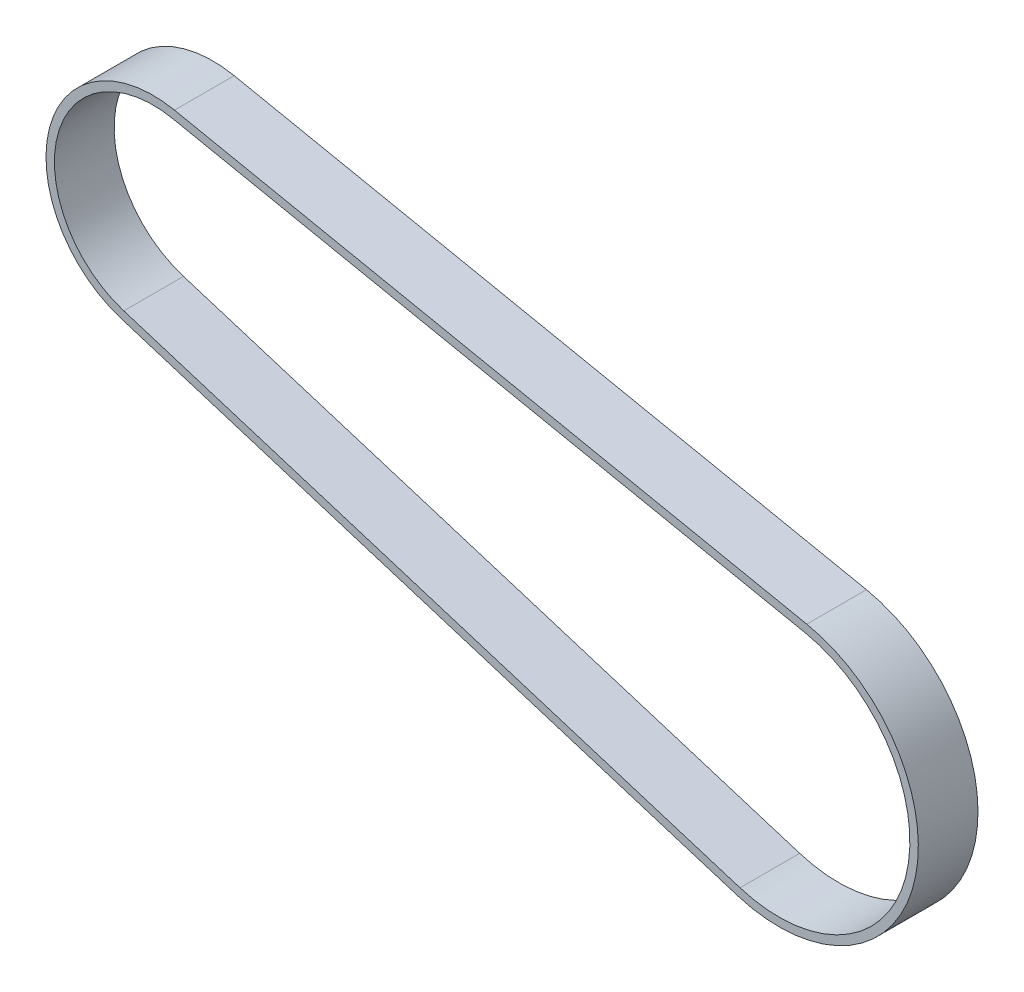
ISO-10303-21;
HEADER;
FILE_DESCRIPTION(('STEP AP214'),'2;1');
FILE_NAME('part.step','',(''),(''),'','','');
FILE_SCHEMA(('AUTOMOTIVE_DESIGN { 1 0 10303 214 1 1 1 1 }'));
ENDSEC;
DATA;
#1=APPLICATION_CONTEXT('core data for automotive mechanical design processes');
#2=APPLICATION_PROTOCOL_DEFINITION('international standard','automotive_design',2000,#1);
#3=PRODUCT_CONTEXT('',#1,'mechanical');
#4=PRODUCT('Part','Part','',(#3));
#5=PRODUCT_RELATED_PRODUCT_CATEGORY('part','',(#4));
#6=PRODUCT_DEFINITION_FORMATION('','',#4);
#7=PRODUCT_DEFINITION_CONTEXT('part definition',#1,'design');
#8=PRODUCT_DEFINITION('design','',#6,#7);
#9=PRODUCT_DEFINITION_SHAPE('','',#8);
#10=(LENGTH_UNIT() NAMED_UNIT(*) SI_UNIT(.MILLI.,.METRE.));
#11=(NAMED_UNIT(*) PLANE_ANGLE_UNIT() SI_UNIT($,.RADIAN.));
#12=(NAMED_UNIT(*) SI_UNIT($,.STERADIAN.) SOLID_ANGLE_UNIT());
#13=UNCERTAINTY_MEASURE_WITH_UNIT(LENGTH_MEASURE(1.E-05),#10,'distance_accuracy_value','');
#14=(GEOMETRIC_REPRESENTATION_CONTEXT(3) GLOBAL_UNCERTAINTY_ASSIGNED_CONTEXT((#13)) GLOBAL_UNIT_ASSIGNED_CONTEXT((#10,
#11,#12)) REPRESENTATION_CONTEXT('',''));
#15=CARTESIAN_POINT('',(0.,0.,0.));
#16=DIRECTION('',(0.,0.,1.));
#17=DIRECTION('',(1.,0.,0.));
#18=AXIS2_PLACEMENT_3D('',#15,#16,#17);
#19=CARTESIAN_POINT('',(8.71789550192988,-17.295897893578,9.));
#20=DIRECTION('',(-0.296824622040405,-0.954932010014625,0.));
#21=DIRECTION('',(0.954932010014625,-0.296824622040405,0.));
#22=AXIS2_PLACEMENT_3D('',#19,#20,#21);
#23=PLANE('',#22);
#24=DIRECTION('',(-0.954932010014625,0.296824622040405,0.));
#25=VECTOR('',#24,1.);
#26=CARTESIAN_POINT('',(8.71789550192988,-17.295897893578,0.));
#27=LINE('',#26,#25);
#28=CARTESIAN_POINT('',(101.620423164441,-46.1730926789959,0.));
#29=VERTEX_POINT('',#28);
#30=CARTESIAN_POINT('',(8.71789550192985,-17.2958978935779,0.));
#31=VERTEX_POINT('',#30);
#32=EDGE_CURVE('E156',#29,#31,#27,.T.);
#33=ORIENTED_EDGE('',*,*,#32,.F.);
#34=DIRECTION('',(0.,0.,-1.));
#35=VECTOR('',#34,1.);
#36=CARTESIAN_POINT('',(101.620423164441,-46.1730926789959,9.));
#37=LINE('',#36,#35);
#38=CARTESIAN_POINT('',(101.620423164441,-46.1730926789959,9.));
#39=VERTEX_POINT('',#38);
#40=EDGE_CURVE('E12',#39,#29,#37,.T.);
#41=ORIENTED_EDGE('',*,*,#40,.F.);
#42=DIRECTION('',(-0.954932010014625,0.296824622040405,0.));
#43=VECTOR('',#42,1.);
#44=CARTESIAN_POINT('',(8.71789550192988,-17.295897893578,9.));
#45=LINE('',#44,#43);
#46=CARTESIAN_POINT('',(8.71789550192985,-17.2958978935779,9.));
#47=VERTEX_POINT('',#46);
#48=EDGE_CURVE('E160',#39,#47,#45,.T.);
#49=ORIENTED_EDGE('',*,*,#48,.T.);
#50=DIRECTION('',(0.,0.,-1.));
#51=VECTOR('',#50,1.);
#52=CARTESIAN_POINT('',(8.71789550192985,-17.2958978935779,9.));
#53=LINE('',#52,#51);
#54=EDGE_CURVE('E61',#47,#31,#53,.T.);
#55=ORIENTED_EDGE('',*,*,#54,.T.);
#56=EDGE_LOOP('',(#33,#41,#49,#55));
#57=FACE_BOUND('',#56,.T.);
#58=ADVANCED_FACE('F58',(#57),#23,.T.);
#59=CARTESIAN_POINT('',(107.85967671973,-26.1004218284885,9.));
#60=DIRECTION('',(0.,0.,-1.));
#61=DIRECTION('',(-1.,0.,0.));
#62=AXIS2_PLACEMENT_3D('',#59,#60,#61);
#63=CYLINDRICAL_SURFACE('',#62,21.02);
#64=CARTESIAN_POINT('',(107.85967671973,-26.1004218284885,0.));
#65=DIRECTION('',(0.,0.,-1.));
#66=DIRECTION('',(-1.,0.,0.));
#67=AXIS2_PLACEMENT_3D('',#64,#65,#66);
#68=CIRCLE('',#67,21.02);
#69=CARTESIAN_POINT('',(112.062109612108,-5.50479224876802,0.));
#70=VERTEX_POINT('',#69);
#71=EDGE_CURVE('E164',#70,#29,#68,.T.);
#72=ORIENTED_EDGE('',*,*,#71,.F.);
#73=DIRECTION('',(0.,0.,-1.));
#74=VECTOR('',#73,1.);
#75=CARTESIAN_POINT('',(112.062109612108,-5.50479224876802,9.));
#76=LINE('',#75,#74);
#77=CARTESIAN_POINT('',(112.062109612108,-5.50479224876802,9.));
#78=VERTEX_POINT('',#77);
#79=EDGE_CURVE('E66',#78,#70,#76,.T.);
#80=ORIENTED_EDGE('',*,*,#79,.F.);
#81=CARTESIAN_POINT('',(107.85967671973,-26.1004218284885,9.));
#82=DIRECTION('',(0.,0.,-1.));
#83=DIRECTION('',(-1.,0.,0.));
#84=AXIS2_PLACEMENT_3D('',#81,#82,#83);
#85=CIRCLE('',#84,21.02);
#86=EDGE_CURVE('E170',#78,#39,#85,.T.);
#87=ORIENTED_EDGE('',*,*,#86,.T.);
#88=ORIENTED_EDGE('',*,*,#40,.T.);
#89=EDGE_LOOP('',(#72,#80,#87,#88));
#90=FACE_BOUND('',#89,.T.);
#91=ADVANCED_FACE('F196',(#90),#63,.T.);
#92=CARTESIAN_POINT('',(16.7391672390236,13.9453666733633,9.));
#93=DIRECTION('',(0.199925446830547,0.979811112260729,0.));
#94=DIRECTION('',(-0.979811112260729,0.199925446830547,0.));
#95=AXIS2_PLACEMENT_3D('',#92,#93,#94);
#96=PLANE('',#95);
#97=DIRECTION('',(0.979811112260729,-0.199925446830547,0.));
#98=VECTOR('',#97,1.);
#99=CARTESIAN_POINT('',(16.7391672390236,13.9453666733633,0.));
#100=LINE('',#99,#98);
#101=CARTESIAN_POINT('',(16.7391672390236,13.9453666733633,0.));
#102=VERTEX_POINT('',#101);
#103=EDGE_CURVE('E178',#102,#70,#100,.T.);
#104=ORIENTED_EDGE('',*,*,#103,.F.);
#105=DIRECTION('',(0.,0.,-1.));
#106=VECTOR('',#105,1.);
#107=CARTESIAN_POINT('',(16.7391672390236,13.9453666733633,9.));
#108=LINE('',#107,#106);
#109=CARTESIAN_POINT('',(16.7391672390236,13.9453666733633,9.));
#110=VERTEX_POINT('',#109);
#111=EDGE_CURVE('E183',#110,#102,#108,.T.);
#112=ORIENTED_EDGE('',*,*,#111,.F.);
#113=DIRECTION('',(0.979811112260729,-0.199925446830547,0.));
#114=VECTOR('',#113,1.);
#115=CARTESIAN_POINT('',(16.7391672390236,13.9453666733633,9.));
#116=LINE('',#115,#114);
#117=EDGE_CURVE('E167',#110,#78,#116,.T.);
#118=ORIENTED_EDGE('',*,*,#117,.T.);
#119=ORIENTED_EDGE('',*,*,#79,.T.);
#120=EDGE_LOOP('',(#104,#112,#118,#119));
#121=FACE_BOUND('',#120,.T.);
#122=ADVANCED_FACE('F200',(#121),#96,.T.);
#123=CARTESIAN_POINT('',(13.5108710863273,-1.87613326186679,9.));
#124=DIRECTION('',(0.,0.,-1.));
#125=DIRECTION('',(-1.,0.,0.));
#126=AXIS2_PLACEMENT_3D('',#123,#124,#125);
#127=CYLINDRICAL_SURFACE('',#126,16.1475);
#128=CARTESIAN_POINT('',(13.5108710863273,-1.87613326186679,0.));
#129=DIRECTION('',(0.,0.,-1.));
#130=DIRECTION('',(-1.,0.,0.));
#131=AXIS2_PLACEMENT_3D('',#128,#129,#130);
#132=CIRCLE('',#131,16.1475);
#133=EDGE_CURVE('E175',#31,#102,#132,.T.);
#134=ORIENTED_EDGE('',*,*,#133,.F.);
#135=ORIENTED_EDGE('',*,*,#54,.F.);
#136=CARTESIAN_POINT('',(13.5108710863273,-1.87613326186679,9.));
#137=DIRECTION('',(0.,0.,-1.));
#138=DIRECTION('',(-1.,0.,0.));
#139=AXIS2_PLACEMENT_3D('',#136,#137,#138);
#140=CIRCLE('',#139,16.1475);
#141=EDGE_CURVE('E163',#47,#110,#140,.T.);
#142=ORIENTED_EDGE('',*,*,#141,.T.);
#143=ORIENTED_EDGE('',*,*,#111,.T.);
#144=EDGE_LOOP('',(#134,#135,#142,#143));
#145=FACE_BOUND('',#144,.T.);
#146=ADVANCED_FACE('F191',(#145),#127,.T.);
#147=CARTESIAN_POINT('',(13.5108710863273,-1.87613326186679,9.));
#148=DIRECTION('',(0.,0.,-1.));
#149=DIRECTION('',(-1.,0.,0.));
#150=AXIS2_PLACEMENT_3D('',#147,#148,#149);
#151=PLANE('',#150);
#152=CARTESIAN_POINT('',(107.85967671973,-26.1004218284885,9.));
#153=DIRECTION('',(0.,0.,-1.));
#154=DIRECTION('',(-1.,0.,0.));
#155=AXIS2_PLACEMENT_3D('',#152,#153,#154);
#156=CIRCLE('',#155,19.75);
#157=CARTESIAN_POINT('',(111.808204294633,-6.74915236133914,9.));
#158=VERTEX_POINT('',#157);
#159=CARTESIAN_POINT('',(101.997390434432,-44.9603290262774,9.));
#160=VERTEX_POINT('',#159);
#161=EDGE_CURVE('E131',#158,#160,#156,.T.);
#162=ORIENTED_EDGE('',*,*,#161,.T.);
#163=DIRECTION('',(-0.954932010014624,0.296824622040405,0.));
#164=VECTOR('',#163,1.);
#165=CARTESIAN_POINT('',(101.997390434432,-44.9603290262774,9.));
#166=LINE('',#165,#164);
#167=CARTESIAN_POINT('',(9.0948627719212,-16.0831342408594,9.));
#168=VERTEX_POINT('',#167);
#169=EDGE_CURVE('E125',#160,#168,#166,.T.);
#170=ORIENTED_EDGE('',*,*,#169,.T.);
#171=CARTESIAN_POINT('',(13.5108710863273,-1.87613326186679,9.));
#172=DIRECTION('',(0.,0.,-1.));
#173=DIRECTION('',(-1.,0.,0.));
#174=AXIS2_PLACEMENT_3D('',#171,#172,#173);
#175=CIRCLE('',#174,14.8775);
#176=CARTESIAN_POINT('',(16.4852619215488,12.7010065607922,9.));
#177=VERTEX_POINT('',#176);
#178=EDGE_CURVE('E134',#168,#177,#175,.T.);
#179=ORIENTED_EDGE('',*,*,#178,.T.);
#180=DIRECTION('',(0.979811112260728,-0.199925446830547,0.));
#181=VECTOR('',#180,1.);
#182=CARTESIAN_POINT('',(16.4852619215488,12.7010065607922,9.));
#183=LINE('',#182,#181);
#184=EDGE_CURVE('E74',#177,#158,#183,.T.);
#185=ORIENTED_EDGE('',*,*,#184,.T.);
#186=EDGE_LOOP('',(#162,#170,#179,#185));
#187=FACE_BOUND('',#186,.T.);
#188=ORIENTED_EDGE('',*,*,#48,.F.);
#189=ORIENTED_EDGE('',*,*,#86,.F.);
#190=ORIENTED_EDGE('',*,*,#117,.F.);
#191=ORIENTED_EDGE('',*,*,#141,.F.);
#192=EDGE_LOOP('',(#188,#189,#190,#191));
#193=FACE_BOUND('',#192,.T.);
#194=ADVANCED_FACE('F138',(#187,#193),#151,.F.);
#195=CARTESIAN_POINT('',(13.5108710863273,-1.87613326186679,0.));
#196=DIRECTION('',(0.,0.,-1.));
#197=DIRECTION('',(-1.,0.,0.));
#198=AXIS2_PLACEMENT_3D('',#195,#196,#197);
#199=PLANE('',#198);
#200=DIRECTION('',(-0.954932010014624,0.296824622040405,0.));
#201=VECTOR('',#200,1.);
#202=CARTESIAN_POINT('',(101.997390434432,-44.9603290262774,0.));
#203=LINE('',#202,#201);
#204=CARTESIAN_POINT('',(101.997390434432,-44.9603290262774,0.));
#205=VERTEX_POINT('',#204);
#206=CARTESIAN_POINT('',(9.0948627719212,-16.0831342408594,0.));
#207=VERTEX_POINT('',#206);
#208=EDGE_CURVE('E82',#205,#207,#203,.T.);
#209=ORIENTED_EDGE('',*,*,#208,.F.);
#210=CARTESIAN_POINT('',(107.85967671973,-26.1004218284885,0.));
#211=DIRECTION('',(0.,0.,-1.));
#212=DIRECTION('',(-1.,0.,0.));
#213=AXIS2_PLACEMENT_3D('',#210,#211,#212);
#214=CIRCLE('',#213,19.75);
#215=CARTESIAN_POINT('',(111.808204294633,-6.74915236133914,0.));
#216=VERTEX_POINT('',#215);
#217=EDGE_CURVE('E141',#216,#205,#214,.T.);
#218=ORIENTED_EDGE('',*,*,#217,.F.);
#219=DIRECTION('',(0.979811112260728,-0.199925446830547,0.));
#220=VECTOR('',#219,1.);
#221=CARTESIAN_POINT('',(16.4852619215488,12.7010065607922,0.));
#222=LINE('',#221,#220);
#223=CARTESIAN_POINT('',(16.4852619215488,12.7010065607922,0.));
#224=VERTEX_POINT('',#223);
#225=EDGE_CURVE('E144',#224,#216,#222,.T.);
#226=ORIENTED_EDGE('',*,*,#225,.F.);
#227=CARTESIAN_POINT('',(13.5108710863273,-1.87613326186679,0.));
#228=DIRECTION('',(0.,0.,-1.));
#229=DIRECTION('',(-1.,0.,0.));
#230=AXIS2_PLACEMENT_3D('',#227,#228,#229);
#231=CIRCLE('',#230,14.8775);
#232=EDGE_CURVE('E150',#207,#224,#231,.T.);
#233=ORIENTED_EDGE('',*,*,#232,.F.);
#234=EDGE_LOOP('',(#209,#218,#226,#233));
#235=FACE_BOUND('',#234,.T.);
#236=ORIENTED_EDGE('',*,*,#32,.T.);
#237=ORIENTED_EDGE('',*,*,#133,.T.);
#238=ORIENTED_EDGE('',*,*,#103,.T.);
#239=ORIENTED_EDGE('',*,*,#71,.T.);
#240=EDGE_LOOP('',(#236,#237,#238,#239));
#241=FACE_BOUND('',#240,.T.);
#242=ADVANCED_FACE('F193',(#235,#241),#199,.T.);
#243=CARTESIAN_POINT('',(101.997390434432,-44.9603290262774,9.));
#244=DIRECTION('',(-0.296824622040405,-0.954932010014624,0.));
#245=DIRECTION('',(0.954932010014625,-0.296824622040405,0.));
#246=AXIS2_PLACEMENT_3D('',#243,#244,#245);
#247=PLANE('',#246);
#248=ORIENTED_EDGE('',*,*,#208,.T.);
#249=DIRECTION('',(0.,0.,-1.));
#250=VECTOR('',#249,1.);
#251=CARTESIAN_POINT('',(9.0948627719212,-16.0831342408594,9.));
#252=LINE('',#251,#250);
#253=EDGE_CURVE('E121',#168,#207,#252,.T.);
#254=ORIENTED_EDGE('',*,*,#253,.F.);
#255=ORIENTED_EDGE('',*,*,#169,.F.);
#256=DIRECTION('',(0.,0.,-1.));
#257=VECTOR('',#256,1.);
#258=CARTESIAN_POINT('',(101.997390434432,-44.9603290262774,9.));
#259=LINE('',#258,#257);
#260=EDGE_CURVE('E154',#160,#205,#259,.T.);
#261=ORIENTED_EDGE('',*,*,#260,.T.);
#262=EDGE_LOOP('',(#248,#254,#255,#261));
#263=FACE_BOUND('',#262,.T.);
#264=ADVANCED_FACE('F123',(#263),#247,.F.);
#265=CARTESIAN_POINT('',(107.85967671973,-26.1004218284885,9.));
#266=DIRECTION('',(0.,0.,-1.));
#267=DIRECTION('',(-1.,0.,0.));
#268=AXIS2_PLACEMENT_3D('',#265,#266,#267);
#269=CYLINDRICAL_SURFACE('',#268,19.75);
#270=ORIENTED_EDGE('',*,*,#217,.T.);
#271=ORIENTED_EDGE('',*,*,#260,.F.);
#272=ORIENTED_EDGE('',*,*,#161,.F.);
#273=DIRECTION('',(0.,0.,-1.));
#274=VECTOR('',#273,1.);
#275=CARTESIAN_POINT('',(111.808204294633,-6.74915236133914,9.));
#276=LINE('',#275,#274);
#277=EDGE_CURVE('E157',#158,#216,#276,.T.);
#278=ORIENTED_EDGE('',*,*,#277,.T.);
#279=EDGE_LOOP('',(#270,#271,#272,#278));
#280=FACE_BOUND('',#279,.T.);
#281=ADVANCED_FACE('F251',(#280),#269,.F.);
#282=CARTESIAN_POINT('',(16.4852619215488,12.7010065607922,9.));
#283=DIRECTION('',(0.199925446830547,0.979811112260728,0.));
#284=DIRECTION('',(-0.979811112260729,0.199925446830547,0.));
#285=AXIS2_PLACEMENT_3D('',#282,#283,#284);
#286=PLANE('',#285);
#287=ORIENTED_EDGE('',*,*,#225,.T.);
#288=ORIENTED_EDGE('',*,*,#277,.F.);
#289=ORIENTED_EDGE('',*,*,#184,.F.);
#290=DIRECTION('',(0.,0.,-1.));
#291=VECTOR('',#290,1.);
#292=CARTESIAN_POINT('',(16.4852619215488,12.7010065607922,9.));
#293=LINE('',#292,#291);
#294=EDGE_CURVE('E130',#177,#224,#293,.T.);
#295=ORIENTED_EDGE('',*,*,#294,.T.);
#296=EDGE_LOOP('',(#287,#288,#289,#295));
#297=FACE_BOUND('',#296,.T.);
#298=ADVANCED_FACE('F260',(#297),#286,.F.);
#299=CARTESIAN_POINT('',(13.5108710863273,-1.87613326186679,9.));
#300=DIRECTION('',(0.,0.,-1.));
#301=DIRECTION('',(-1.,0.,0.));
#302=AXIS2_PLACEMENT_3D('',#299,#300,#301);
#303=CYLINDRICAL_SURFACE('',#302,14.8775);
#304=ORIENTED_EDGE('',*,*,#232,.T.);
#305=ORIENTED_EDGE('',*,*,#294,.F.);
#306=ORIENTED_EDGE('',*,*,#178,.F.);
#307=ORIENTED_EDGE('',*,*,#253,.T.);
#308=EDGE_LOOP('',(#304,#305,#306,#307));
#309=FACE_BOUND('',#308,.T.);
#310=ADVANCED_FACE('F135',(#309),#303,.F.);
#311=CLOSED_SHELL('',(#58,#91,#122,#146,#194,#242,#264,#281,#298,#310));
#312=MANIFOLD_SOLID_BREP('B2',#311);
#313=ADVANCED_BREP_SHAPE_REPRESENTATION('',(#18,#312),#14);
#314=SHAPE_DEFINITION_REPRESENTATION(#9,#313);
ENDSEC;
END-ISO-10303-21;
